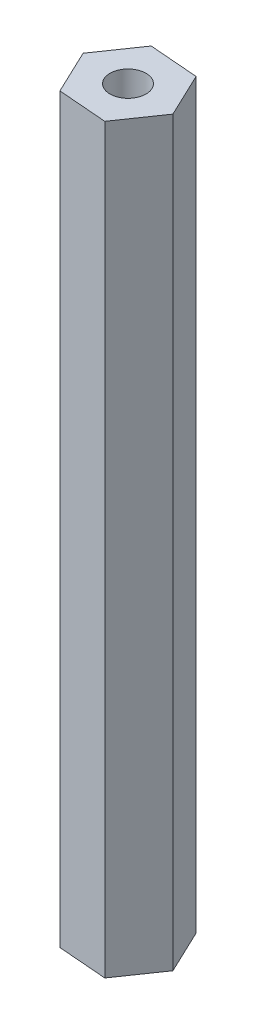
ISO-10303-21;
HEADER;
FILE_DESCRIPTION(('STEP AP214'),'2;1');
FILE_NAME('part.step','',(''),(''),'','','');
FILE_SCHEMA(('AUTOMOTIVE_DESIGN { 1 0 10303 214 1 1 1 1 }'));
ENDSEC;
DATA;
#1=APPLICATION_CONTEXT('core data for automotive mechanical design processes');
#2=APPLICATION_PROTOCOL_DEFINITION('international standard','automotive_design',2000,#1);
#3=PRODUCT_CONTEXT('',#1,'mechanical');
#4=PRODUCT('Part','Part','',(#3));
#5=PRODUCT_RELATED_PRODUCT_CATEGORY('part','',(#4));
#6=PRODUCT_DEFINITION_FORMATION('','',#4);
#7=PRODUCT_DEFINITION_CONTEXT('part definition',#1,'design');
#8=PRODUCT_DEFINITION('design','',#6,#7);
#9=PRODUCT_DEFINITION_SHAPE('','',#8);
#10=(LENGTH_UNIT() NAMED_UNIT(*) SI_UNIT(.MILLI.,.METRE.));
#11=(NAMED_UNIT(*) PLANE_ANGLE_UNIT() SI_UNIT($,.RADIAN.));
#12=(NAMED_UNIT(*) SI_UNIT($,.STERADIAN.) SOLID_ANGLE_UNIT());
#13=UNCERTAINTY_MEASURE_WITH_UNIT(LENGTH_MEASURE(1.E-05),#10,'distance_accuracy_value','');
#14=(GEOMETRIC_REPRESENTATION_CONTEXT(3) GLOBAL_UNCERTAINTY_ASSIGNED_CONTEXT((#13)) GLOBAL_UNIT_ASSIGNED_CONTEXT((#10,
#11,#12)) REPRESENTATION_CONTEXT('',''));
#15=CARTESIAN_POINT('',(0.,0.,0.));
#16=DIRECTION('',(0.,0.,1.));
#17=DIRECTION('',(1.,0.,0.));
#18=AXIS2_PLACEMENT_3D('',#15,#16,#17);
#19=CARTESIAN_POINT('',(-19.0573914636886,-71.,25.556692678821));
#20=DIRECTION('',(0.823328244016986,0.,0.567565505121573));
#21=DIRECTION('',(0.567565505121573,0.,-0.823328244016986));
#22=AXIS2_PLACEMENT_3D('',#19,#20,#21);
#23=PLANE('',#22);
#24=DIRECTION('',(0.567565505121573,0.,-0.823328244016986));
#25=VECTOR('',#24,1.);
#26=CARTESIAN_POINT('',(-19.0573914636886,-1.,25.556692678821));
#27=LINE('',#26,#25);
#28=CARTESIAN_POINT('',(-19.0573914636886,-1.,25.556692678821));
#29=VERTEX_POINT('',#28);
#30=CARTESIAN_POINT('',(-16.4359186863711,-1.,21.7539024123039));
#31=VERTEX_POINT('',#30);
#32=EDGE_CURVE('E133',#29,#31,#27,.T.);
#33=ORIENTED_EDGE('',*,*,#32,.F.);
#34=DIRECTION('',(0.,1.,0.));
#35=VECTOR('',#34,1.);
#36=CARTESIAN_POINT('',(-19.0573914636886,-71.,25.556692678821));
#37=LINE('',#36,#35);
#38=CARTESIAN_POINT('',(-19.0573914636886,-71.,25.556692678821));
#39=VERTEX_POINT('',#38);
#40=EDGE_CURVE('E11',#39,#29,#37,.T.);
#41=ORIENTED_EDGE('',*,*,#40,.F.);
#42=DIRECTION('',(0.567565505121573,0.,-0.823328244016986));
#43=VECTOR('',#42,1.);
#44=CARTESIAN_POINT('',(-19.0573914636886,-71.,25.556692678821));
#45=LINE('',#44,#43);
#46=CARTESIAN_POINT('',(-16.4359186863711,-71.,21.7539024123039));
#47=VERTEX_POINT('',#46);
#48=EDGE_CURVE('E151',#39,#47,#45,.T.);
#49=ORIENTED_EDGE('',*,*,#48,.T.);
#50=DIRECTION('',(0.,1.,0.));
#51=VECTOR('',#50,1.);
#52=CARTESIAN_POINT('',(-16.4359186863711,-71.,21.7539024123039));
#53=LINE('',#52,#51);
#54=EDGE_CURVE('E45',#47,#31,#53,.T.);
#55=ORIENTED_EDGE('',*,*,#54,.T.);
#56=EDGE_LOOP('',(#33,#41,#49,#55));
#57=FACE_BOUND('',#56,.T.);
#58=ADVANCED_FACE('F42',(#57),#23,.T.);
#59=CARTESIAN_POINT('',(-23.6614408284153,-71.,25.1878257915932));
#60=DIRECTION('',(-0.079862023738536,0.,0.996805927532729));
#61=DIRECTION('',(0.99680592753273,0.,0.079862023738536));
#62=AXIS2_PLACEMENT_3D('',#59,#60,#61);
#63=PLANE('',#62);
#64=DIRECTION('',(0.996805927532729,0.,0.079862023738536));
#65=VECTOR('',#64,1.);
#66=CARTESIAN_POINT('',(-23.6614408284153,-1.,25.1878257915932));
#67=LINE('',#66,#65);
#68=CARTESIAN_POINT('',(-23.6614408284153,-1.,25.1878257915932));
#69=VERTEX_POINT('',#68);
#70=EDGE_CURVE('E148',#69,#29,#67,.T.);
#71=ORIENTED_EDGE('',*,*,#70,.F.);
#72=DIRECTION('',(0.,1.,0.));
#73=VECTOR('',#72,1.);
#74=CARTESIAN_POINT('',(-23.6614408284153,-71.,25.1878257915932));
#75=LINE('',#74,#73);
#76=CARTESIAN_POINT('',(-23.6614408284153,-71.,25.1878257915932));
#77=VERTEX_POINT('',#76);
#78=EDGE_CURVE('E51',#77,#69,#75,.T.);
#79=ORIENTED_EDGE('',*,*,#78,.F.);
#80=DIRECTION('',(0.996805927532729,0.,0.079862023738536));
#81=VECTOR('',#80,1.);
#82=CARTESIAN_POINT('',(-23.6614408284153,-71.,25.1878257915932));
#83=LINE('',#82,#81);
#84=EDGE_CURVE('E118',#77,#39,#83,.T.);
#85=ORIENTED_EDGE('',*,*,#84,.T.);
#86=ORIENTED_EDGE('',*,*,#40,.T.);
#87=EDGE_LOOP('',(#71,#79,#85,#86));
#88=FACE_BOUND('',#87,.T.);
#89=ADVANCED_FACE('F167',(#88),#63,.T.);
#90=CARTESIAN_POINT('',(-25.6440174158245,-71.,21.0161686378484));
#91=DIRECTION('',(-0.903190267755522,0.,0.429240422411157));
#92=DIRECTION('',(0.429240422411157,0.,0.903190267755522));
#93=AXIS2_PLACEMENT_3D('',#90,#91,#92);
#94=PLANE('',#93);
#95=DIRECTION('',(0.429240422411157,0.,0.903190267755522));
#96=VECTOR('',#95,1.);
#97=CARTESIAN_POINT('',(-25.6440174158245,-1.,21.0161686378484));
#98=LINE('',#97,#96);
#99=CARTESIAN_POINT('',(-25.6440174158245,-1.,21.0161686378484));
#100=VERTEX_POINT('',#99);
#101=EDGE_CURVE('E104',#100,#69,#98,.T.);
#102=ORIENTED_EDGE('',*,*,#101,.F.);
#103=DIRECTION('',(0.,1.,0.));
#104=VECTOR('',#103,1.);
#105=CARTESIAN_POINT('',(-25.6440174158245,-71.,21.0161686378484));
#106=LINE('',#105,#104);
#107=CARTESIAN_POINT('',(-25.6440174158245,-71.,21.0161686378484));
#108=VERTEX_POINT('',#107);
#109=EDGE_CURVE('E99',#108,#100,#106,.T.);
#110=ORIENTED_EDGE('',*,*,#109,.F.);
#111=DIRECTION('',(0.429240422411157,0.,0.903190267755522));
#112=VECTOR('',#111,1.);
#113=CARTESIAN_POINT('',(-25.6440174158245,-71.,21.0161686378484));
#114=LINE('',#113,#112);
#115=EDGE_CURVE('E102',#108,#77,#114,.T.);
#116=ORIENTED_EDGE('',*,*,#115,.T.);
#117=ORIENTED_EDGE('',*,*,#78,.T.);
#118=EDGE_LOOP('',(#102,#110,#116,#117));
#119=FACE_BOUND('',#118,.T.);
#120=ADVANCED_FACE('F101',(#119),#94,.T.);
#121=CARTESIAN_POINT('',(-23.022544638507,-71.,17.2133783713313));
#122=DIRECTION('',(-0.823328244016986,0.,-0.567565505121573));
#123=DIRECTION('',(-0.567565505121573,0.,0.823328244016986));
#124=AXIS2_PLACEMENT_3D('',#121,#122,#123);
#125=PLANE('',#124);
#126=DIRECTION('',(-0.567565505121573,0.,0.823328244016986));
#127=VECTOR('',#126,1.);
#128=CARTESIAN_POINT('',(-23.022544638507,-1.,17.2133783713313));
#129=LINE('',#128,#127);
#130=CARTESIAN_POINT('',(-23.022544638507,-1.,17.2133783713313));
#131=VERTEX_POINT('',#130);
#132=EDGE_CURVE('E144',#131,#100,#129,.T.);
#133=ORIENTED_EDGE('',*,*,#132,.F.);
#134=DIRECTION('',(0.,1.,0.));
#135=VECTOR('',#134,1.);
#136=CARTESIAN_POINT('',(-23.022544638507,-71.,17.2133783713313));
#137=LINE('',#136,#135);
#138=CARTESIAN_POINT('',(-23.022544638507,-71.,17.2133783713313));
#139=VERTEX_POINT('',#138);
#140=EDGE_CURVE('E110',#139,#131,#137,.T.);
#141=ORIENTED_EDGE('',*,*,#140,.F.);
#142=DIRECTION('',(-0.567565505121573,0.,0.823328244016986));
#143=VECTOR('',#142,1.);
#144=CARTESIAN_POINT('',(-23.022544638507,-71.,17.2133783713313));
#145=LINE('',#144,#143);
#146=EDGE_CURVE('E116',#139,#108,#145,.T.);
#147=ORIENTED_EDGE('',*,*,#146,.T.);
#148=ORIENTED_EDGE('',*,*,#109,.T.);
#149=EDGE_LOOP('',(#133,#141,#147,#148));
#150=FACE_BOUND('',#149,.T.);
#151=ADVANCED_FACE('F121',(#150),#125,.T.);
#152=CARTESIAN_POINT('',(-18.4184952737803,-71.,17.5822452585591));
#153=DIRECTION('',(0.079862023738536,0.,-0.996805927532729));
#154=DIRECTION('',(-0.99680592753273,0.,-0.079862023738536));
#155=AXIS2_PLACEMENT_3D('',#152,#153,#154);
#156=PLANE('',#155);
#157=DIRECTION('',(-0.996805927532729,0.,-0.079862023738536));
#158=VECTOR('',#157,1.);
#159=CARTESIAN_POINT('',(-18.4184952737803,-1.,17.5822452585591));
#160=LINE('',#159,#158);
#161=CARTESIAN_POINT('',(-18.4184952737803,-1.,17.5822452585591));
#162=VERTEX_POINT('',#161);
#163=EDGE_CURVE('E141',#162,#131,#160,.T.);
#164=ORIENTED_EDGE('',*,*,#163,.F.);
#165=DIRECTION('',(0.,1.,0.));
#166=VECTOR('',#165,1.);
#167=CARTESIAN_POINT('',(-18.4184952737803,-71.,17.5822452585591));
#168=LINE('',#167,#166);
#169=CARTESIAN_POINT('',(-18.4184952737803,-71.,17.5822452585591));
#170=VERTEX_POINT('',#169);
#171=EDGE_CURVE('E155',#170,#162,#168,.T.);
#172=ORIENTED_EDGE('',*,*,#171,.F.);
#173=DIRECTION('',(-0.996805927532729,0.,-0.079862023738536));
#174=VECTOR('',#173,1.);
#175=CARTESIAN_POINT('',(-18.4184952737803,-71.,17.5822452585591));
#176=LINE('',#175,#174);
#177=EDGE_CURVE('E123',#170,#139,#176,.T.);
#178=ORIENTED_EDGE('',*,*,#177,.T.);
#179=ORIENTED_EDGE('',*,*,#140,.T.);
#180=EDGE_LOOP('',(#164,#172,#178,#179));
#181=FACE_BOUND('',#180,.T.);
#182=ADVANCED_FACE('F180',(#181),#156,.T.);
#183=CARTESIAN_POINT('',(-16.4359186863711,-71.,21.7539024123039));
#184=DIRECTION('',(0.903190267755522,0.,-0.429240422411156));
#185=DIRECTION('',(-0.429240422411156,0.,-0.903190267755522));
#186=AXIS2_PLACEMENT_3D('',#183,#184,#185);
#187=PLANE('',#186);
#188=DIRECTION('',(-0.429240422411156,0.,-0.903190267755522));
#189=VECTOR('',#188,1.);
#190=CARTESIAN_POINT('',(-16.4359186863711,-1.,21.7539024123039));
#191=LINE('',#190,#189);
#192=EDGE_CURVE('E137',#31,#162,#191,.T.);
#193=ORIENTED_EDGE('',*,*,#192,.F.);
#194=ORIENTED_EDGE('',*,*,#54,.F.);
#195=DIRECTION('',(-0.429240422411156,0.,-0.903190267755522));
#196=VECTOR('',#195,1.);
#197=CARTESIAN_POINT('',(-16.4359186863711,-71.,21.7539024123039));
#198=LINE('',#197,#196);
#199=EDGE_CURVE('E128',#47,#170,#198,.T.);
#200=ORIENTED_EDGE('',*,*,#199,.T.);
#201=ORIENTED_EDGE('',*,*,#171,.T.);
#202=EDGE_LOOP('',(#193,#194,#200,#201));
#203=FACE_BOUND('',#202,.T.);
#204=ADVANCED_FACE('F164',(#203),#187,.T.);
#205=CARTESIAN_POINT('',(-21.0399680510978,-71.,21.3850355250761));
#206=DIRECTION('',(0.,1.,0.));
#207=DIRECTION('',(-0.903190267755522,0.,0.429240422411156));
#208=AXIS2_PLACEMENT_3D('',#205,#206,#207);
#209=PLANE('',#208);
#210=CARTESIAN_POINT('',(-21.0399680510978,-71.,21.3850355250761));
#211=DIRECTION('',(0.,1.,0.));
#212=DIRECTION('',(-0.903190267755522,0.,0.429240422411156));
#213=AXIS2_PLACEMENT_3D('',#210,#211,#212);
#214=CIRCLE('',#213,1.7);
#215=CARTESIAN_POINT('',(-22.5753915062822,-71.,22.1147442431751));
#216=VERTEX_POINT('',#215);
#217=EDGE_CURVE('E138',#216,#216,#214,.T.);
#218=ORIENTED_EDGE('',*,*,#217,.T.);
#219=EDGE_LOOP('',(#218));
#220=FACE_BOUND('',#219,.T.);
#221=ORIENTED_EDGE('',*,*,#48,.F.);
#222=ORIENTED_EDGE('',*,*,#84,.F.);
#223=ORIENTED_EDGE('',*,*,#115,.F.);
#224=ORIENTED_EDGE('',*,*,#146,.F.);
#225=ORIENTED_EDGE('',*,*,#177,.F.);
#226=ORIENTED_EDGE('',*,*,#199,.F.);
#227=EDGE_LOOP('',(#221,#222,#223,#224,#225,#226));
#228=FACE_BOUND('',#227,.T.);
#229=ADVANCED_FACE('F114',(#220,#228),#209,.F.);
#230=CARTESIAN_POINT('',(-21.0399680510978,-1.,21.3850355250761));
#231=DIRECTION('',(0.,1.,0.));
#232=DIRECTION('',(-0.903190267755522,0.,0.429240422411156));
#233=AXIS2_PLACEMENT_3D('',#230,#231,#232);
#234=PLANE('',#233);
#235=CARTESIAN_POINT('',(-21.0399680510978,-1.,21.3850355250761));
#236=DIRECTION('',(0.,1.,0.));
#237=DIRECTION('',(-0.903190267755522,0.,0.429240422411156));
#238=AXIS2_PLACEMENT_3D('',#235,#236,#237);
#239=CIRCLE('',#238,1.7);
#240=CARTESIAN_POINT('',(-22.5753915062822,-1.,22.1147442431751));
#241=VERTEX_POINT('',#240);
#242=EDGE_CURVE('E203',#241,#241,#239,.T.);
#243=ORIENTED_EDGE('',*,*,#242,.F.);
#244=EDGE_LOOP('',(#243));
#245=FACE_BOUND('',#244,.T.);
#246=ORIENTED_EDGE('',*,*,#32,.T.);
#247=ORIENTED_EDGE('',*,*,#192,.T.);
#248=ORIENTED_EDGE('',*,*,#163,.T.);
#249=ORIENTED_EDGE('',*,*,#132,.T.);
#250=ORIENTED_EDGE('',*,*,#101,.T.);
#251=ORIENTED_EDGE('',*,*,#70,.T.);
#252=EDGE_LOOP('',(#246,#247,#248,#249,#250,#251));
#253=FACE_BOUND('',#252,.T.);
#254=ADVANCED_FACE('F166',(#245,#253),#234,.T.);
#255=CARTESIAN_POINT('',(-21.0399680510978,-71.,21.3850355250761));
#256=DIRECTION('',(0.,1.,0.));
#257=DIRECTION('',(-0.903190267755522,0.,0.429240422411156));
#258=AXIS2_PLACEMENT_3D('',#255,#256,#257);
#259=CYLINDRICAL_SURFACE('',#258,1.7);
#260=ORIENTED_EDGE('',*,*,#217,.F.);
#261=EDGE_LOOP('',(#260));
#262=FACE_BOUND('',#261,.T.);
#263=ORIENTED_EDGE('',*,*,#242,.T.);
#264=EDGE_LOOP('',(#263));
#265=FACE_BOUND('',#264,.T.);
#266=ADVANCED_FACE('F191',(#262,#265),#259,.F.);
#267=CLOSED_SHELL('',(#58,#89,#120,#151,#182,#204,#229,#254,#266));
#268=MANIFOLD_SOLID_BREP('B2',#267);
#269=ADVANCED_BREP_SHAPE_REPRESENTATION('',(#18,#268),#14);
#270=SHAPE_DEFINITION_REPRESENTATION(#9,#269);
ENDSEC;
END-ISO-10303-21;
